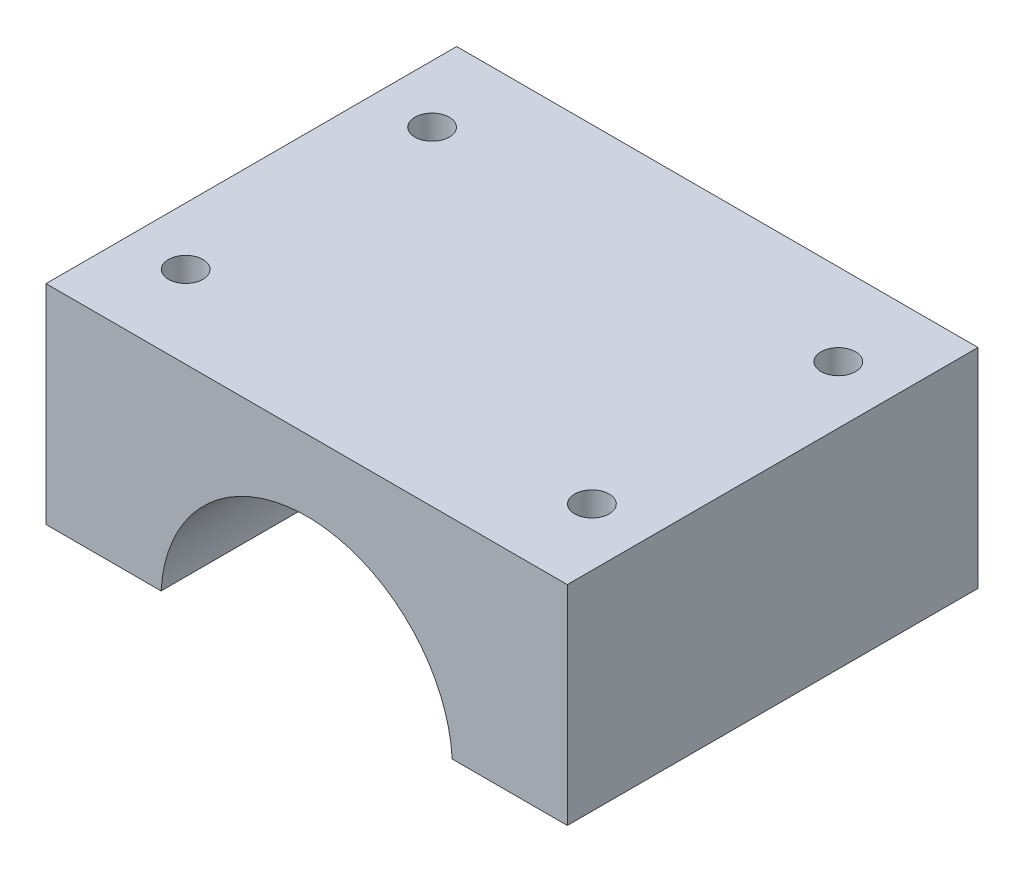
ISO-10303-21;
HEADER;
FILE_DESCRIPTION(('STEP AP214'),'2;1');
FILE_NAME('part.step','',(''),(''),'','','');
FILE_SCHEMA(('AUTOMOTIVE_DESIGN { 1 0 10303 214 1 1 1 1 }'));
ENDSEC;
DATA;
#1=APPLICATION_CONTEXT('core data for automotive mechanical design processes');
#2=APPLICATION_PROTOCOL_DEFINITION('international standard','automotive_design',2000,#1);
#3=PRODUCT_CONTEXT('',#1,'mechanical');
#4=PRODUCT('Part','Part','',(#3));
#5=PRODUCT_RELATED_PRODUCT_CATEGORY('part','',(#4));
#6=PRODUCT_DEFINITION_FORMATION('','',#4);
#7=PRODUCT_DEFINITION_CONTEXT('part definition',#1,'design');
#8=PRODUCT_DEFINITION('design','',#6,#7);
#9=PRODUCT_DEFINITION_SHAPE('','',#8);
#10=(LENGTH_UNIT() NAMED_UNIT(*) SI_UNIT(.MILLI.,.METRE.));
#11=(NAMED_UNIT(*) PLANE_ANGLE_UNIT() SI_UNIT($,.RADIAN.));
#12=(NAMED_UNIT(*) SI_UNIT($,.STERADIAN.) SOLID_ANGLE_UNIT());
#13=UNCERTAINTY_MEASURE_WITH_UNIT(LENGTH_MEASURE(1.E-05),#10,'distance_accuracy_value','');
#14=(GEOMETRIC_REPRESENTATION_CONTEXT(3) GLOBAL_UNCERTAINTY_ASSIGNED_CONTEXT((#13)) GLOBAL_UNIT_ASSIGNED_CONTEXT((#10,
#11,#12)) REPRESENTATION_CONTEXT('',''));
#15=CARTESIAN_POINT('',(0.,0.,0.));
#16=DIRECTION('',(0.,0.,1.));
#17=DIRECTION('',(1.,0.,0.));
#18=AXIS2_PLACEMENT_3D('',#15,#16,#17);
#19=CARTESIAN_POINT('',(17.7218085984473,1.,50.));
#20=DIRECTION('',(0.,1.,0.));
#21=DIRECTION('',(0.,0.,1.));
#22=AXIS2_PLACEMENT_3D('',#19,#20,#21);
#23=PLANE('',#22);
#24=DIRECTION('',(1.,0.,0.));
#25=VECTOR('',#24,1.);
#26=CARTESIAN_POINT('',(17.7218085984473,1.,0.));
#27=LINE('',#26,#25);
#28=CARTESIAN_POINT('',(17.7218085984473,1.,0.));
#29=VERTEX_POINT('',#28);
#30=CARTESIAN_POINT('',(31.734248061046,1.,0.));
#31=VERTEX_POINT('',#30);
#32=EDGE_CURVE('E99',#29,#31,#27,.T.);
#33=ORIENTED_EDGE('',*,*,#32,.T.);
#34=DIRECTION('',(0.,0.,-1.));
#35=VECTOR('',#34,1.);
#36=CARTESIAN_POINT('',(31.734248061046,1.,50.));
#37=LINE('',#36,#35);
#38=CARTESIAN_POINT('',(31.734248061046,1.,50.));
#39=VERTEX_POINT('',#38);
#40=EDGE_CURVE('E151',#39,#31,#37,.T.);
#41=ORIENTED_EDGE('',*,*,#40,.F.);
#42=DIRECTION('',(1.,0.,0.));
#43=VECTOR('',#42,1.);
#44=CARTESIAN_POINT('',(17.7218085984473,1.,50.));
#45=LINE('',#44,#43);
#46=CARTESIAN_POINT('',(17.7218085984473,1.,50.));
#47=VERTEX_POINT('',#46);
#48=EDGE_CURVE('E149',#47,#39,#45,.T.);
#49=ORIENTED_EDGE('',*,*,#48,.F.);
#50=DIRECTION('',(0.,0.,-1.));
#51=VECTOR('',#50,1.);
#52=CARTESIAN_POINT('',(17.7218085984473,1.,50.));
#53=LINE('',#52,#51);
#54=EDGE_CURVE('E157',#47,#29,#53,.T.);
#55=ORIENTED_EDGE('',*,*,#54,.T.);
#56=EDGE_LOOP('',(#33,#41,#49,#55));
#57=FACE_BOUND('',#56,.T.);
#58=CARTESIAN_POINT('',(24.7280283297466,1.,10.0000000000001));
#59=DIRECTION('',(0.,-1.,0.));
#60=DIRECTION('',(0.,0.,-1.));
#61=AXIS2_PLACEMENT_3D('',#58,#59,#60);
#62=CIRCLE('',#61,2.1);
#63=CARTESIAN_POINT('',(24.7280283297466,1.,7.90000000000006));
#64=VERTEX_POINT('',#63);
#65=EDGE_CURVE('E134',#64,#64,#62,.T.);
#66=ORIENTED_EDGE('',*,*,#65,.F.);
#67=EDGE_LOOP('',(#66));
#68=FACE_BOUND('',#67,.T.);
#69=CARTESIAN_POINT('',(24.7280283297466,1.,40.));
#70=DIRECTION('',(0.,-1.,0.));
#71=DIRECTION('',(0.,0.,-1.));
#72=AXIS2_PLACEMENT_3D('',#69,#70,#71);
#73=CIRCLE('',#72,2.1);
#74=CARTESIAN_POINT('',(24.7280283297466,1.,37.9));
#75=VERTEX_POINT('',#74);
#76=EDGE_CURVE('E138',#75,#75,#73,.T.);
#77=ORIENTED_EDGE('',*,*,#76,.F.);
#78=EDGE_LOOP('',(#77));
#79=FACE_BOUND('',#78,.T.);
#80=ADVANCED_FACE('F56',(#57,#68,#79),#23,.F.);
#81=CARTESIAN_POINT('',(-31.734248061046,1.,50.));
#82=DIRECTION('',(0.,1.,0.));
#83=DIRECTION('',(0.,0.,1.));
#84=AXIS2_PLACEMENT_3D('',#81,#82,#83);
#85=PLANE('',#84);
#86=CARTESIAN_POINT('',(-24.7280283297466,1.,40.));
#87=DIRECTION('',(0.,-1.,0.));
#88=DIRECTION('',(0.,0.,-1.));
#89=AXIS2_PLACEMENT_3D('',#86,#87,#88);
#90=CIRCLE('',#89,2.1);
#91=CARTESIAN_POINT('',(-24.7280283297466,1.,37.9));
#92=VERTEX_POINT('',#91);
#93=EDGE_CURVE('E181',#92,#92,#90,.T.);
#94=ORIENTED_EDGE('',*,*,#93,.F.);
#95=EDGE_LOOP('',(#94));
#96=FACE_BOUND('',#95,.T.);
#97=CARTESIAN_POINT('',(-24.7280283297466,1.,10.));
#98=DIRECTION('',(0.,-1.,0.));
#99=DIRECTION('',(0.,0.,-1.));
#100=AXIS2_PLACEMENT_3D('',#97,#98,#99);
#101=CIRCLE('',#100,2.1);
#102=CARTESIAN_POINT('',(-24.7280283297466,1.,7.9));
#103=VERTEX_POINT('',#102);
#104=EDGE_CURVE('E178',#103,#103,#101,.T.);
#105=ORIENTED_EDGE('',*,*,#104,.F.);
#106=EDGE_LOOP('',(#105));
#107=FACE_BOUND('',#106,.T.);
#108=DIRECTION('',(1.,0.,0.));
#109=VECTOR('',#108,1.);
#110=CARTESIAN_POINT('',(-31.734248061046,1.,0.));
#111=LINE('',#110,#109);
#112=CARTESIAN_POINT('',(-31.734248061046,1.,0.));
#113=VERTEX_POINT('',#112);
#114=CARTESIAN_POINT('',(-17.7218085984473,0.999999999999997,0.));
#115=VERTEX_POINT('',#114);
#116=EDGE_CURVE('E144',#113,#115,#111,.T.);
#117=ORIENTED_EDGE('',*,*,#116,.T.);
#118=DIRECTION('',(0.,0.,-1.));
#119=VECTOR('',#118,1.);
#120=CARTESIAN_POINT('',(-17.7218085984473,0.999999999999997,50.));
#121=LINE('',#120,#119);
#122=CARTESIAN_POINT('',(-17.7218085984473,0.999999999999997,50.));
#123=VERTEX_POINT('',#122);
#124=EDGE_CURVE('E64',#123,#115,#121,.T.);
#125=ORIENTED_EDGE('',*,*,#124,.F.);
#126=DIRECTION('',(1.,0.,0.));
#127=VECTOR('',#126,1.);
#128=CARTESIAN_POINT('',(-31.734248061046,1.,50.));
#129=LINE('',#128,#127);
#130=CARTESIAN_POINT('',(-31.734248061046,1.,50.));
#131=VERTEX_POINT('',#130);
#132=EDGE_CURVE('E105',#131,#123,#129,.T.);
#133=ORIENTED_EDGE('',*,*,#132,.F.);
#134=DIRECTION('',(0.,0.,-1.));
#135=VECTOR('',#134,1.);
#136=CARTESIAN_POINT('',(-31.734248061046,1.,50.));
#137=LINE('',#136,#135);
#138=EDGE_CURVE('E12',#131,#113,#137,.T.);
#139=ORIENTED_EDGE('',*,*,#138,.T.);
#140=EDGE_LOOP('',(#117,#125,#133,#139));
#141=FACE_BOUND('',#140,.T.);
#142=ADVANCED_FACE('F58',(#96,#107,#141),#85,.F.);
#143=CARTESIAN_POINT('',(0.,0.,50.));
#144=DIRECTION('',(0.,0.,-1.));
#145=DIRECTION('',(-1.,0.,0.));
#146=AXIS2_PLACEMENT_3D('',#143,#144,#145);
#147=CYLINDRICAL_SURFACE('',#146,17.75);
#148=CARTESIAN_POINT('',(0.,0.,0.));
#149=DIRECTION('',(0.,0.,-1.));
#150=DIRECTION('',(1.,0.,0.));
#151=AXIS2_PLACEMENT_3D('',#148,#149,#150);
#152=CIRCLE('',#151,17.75);
#153=EDGE_CURVE('E153',#115,#29,#152,.T.);
#154=ORIENTED_EDGE('',*,*,#153,.T.);
#155=ORIENTED_EDGE('',*,*,#54,.F.);
#156=CARTESIAN_POINT('',(0.,0.,50.));
#157=DIRECTION('',(0.,0.,-1.));
#158=DIRECTION('',(1.,0.,0.));
#159=AXIS2_PLACEMENT_3D('',#156,#157,#158);
#160=CIRCLE('',#159,17.75);
#161=EDGE_CURVE('E147',#123,#47,#160,.T.);
#162=ORIENTED_EDGE('',*,*,#161,.F.);
#163=ORIENTED_EDGE('',*,*,#124,.T.);
#164=EDGE_LOOP('',(#154,#155,#162,#163));
#165=FACE_BOUND('',#164,.T.);
#166=ADVANCED_FACE('F162',(#165),#147,.F.);
#167=CARTESIAN_POINT('',(0.,0.,50.));
#168=DIRECTION('',(0.,0.,1.));
#169=DIRECTION('',(1.,0.,0.));
#170=AXIS2_PLACEMENT_3D('',#167,#168,#169);
#171=PLANE('',#170);
#172=DIRECTION('',(1.,0.,0.));
#173=VECTOR('',#172,1.);
#174=CARTESIAN_POINT('',(-31.734248061046,26.4,50.));
#175=LINE('',#174,#173);
#176=CARTESIAN_POINT('',(-31.734248061046,26.4,50.));
#177=VERTEX_POINT('',#176);
#178=CARTESIAN_POINT('',(31.734248061046,26.4,50.));
#179=VERTEX_POINT('',#178);
#180=EDGE_CURVE('E122',#177,#179,#175,.T.);
#181=ORIENTED_EDGE('',*,*,#180,.F.);
#182=DIRECTION('',(0.,-1.,0.));
#183=VECTOR('',#182,1.);
#184=CARTESIAN_POINT('',(-31.734248061046,0.,50.));
#185=LINE('',#184,#183);
#186=EDGE_CURVE('E129',#177,#131,#185,.T.);
#187=ORIENTED_EDGE('',*,*,#186,.T.);
#188=ORIENTED_EDGE('',*,*,#132,.T.);
#189=ORIENTED_EDGE('',*,*,#161,.T.);
#190=ORIENTED_EDGE('',*,*,#48,.T.);
#191=DIRECTION('',(0.,-1.,0.));
#192=VECTOR('',#191,1.);
#193=CARTESIAN_POINT('',(31.734248061046,0.,50.));
#194=LINE('',#193,#192);
#195=EDGE_CURVE('E80',#179,#39,#194,.T.);
#196=ORIENTED_EDGE('',*,*,#195,.F.);
#197=EDGE_LOOP('',(#181,#187,#188,#189,#190,#196));
#198=FACE_BOUND('',#197,.T.);
#199=ADVANCED_FACE('F128',(#198),#171,.T.);
#200=CARTESIAN_POINT('',(0.,0.,0.));
#201=DIRECTION('',(0.,0.,1.));
#202=DIRECTION('',(1.,0.,0.));
#203=AXIS2_PLACEMENT_3D('',#200,#201,#202);
#204=PLANE('',#203);
#205=DIRECTION('',(0.,1.,0.));
#206=VECTOR('',#205,1.);
#207=CARTESIAN_POINT('',(-31.734248061046,0.,0.));
#208=LINE('',#207,#206);
#209=CARTESIAN_POINT('',(-31.734248061046,26.4,0.));
#210=VERTEX_POINT('',#209);
#211=EDGE_CURVE('E133',#113,#210,#208,.T.);
#212=ORIENTED_EDGE('',*,*,#211,.T.);
#213=DIRECTION('',(-1.,0.,0.));
#214=VECTOR('',#213,1.);
#215=CARTESIAN_POINT('',(-31.734248061046,26.4,0.));
#216=LINE('',#215,#214);
#217=CARTESIAN_POINT('',(31.734248061046,26.4,0.));
#218=VERTEX_POINT('',#217);
#219=EDGE_CURVE('E71',#218,#210,#216,.T.);
#220=ORIENTED_EDGE('',*,*,#219,.F.);
#221=DIRECTION('',(0.,1.,0.));
#222=VECTOR('',#221,1.);
#223=CARTESIAN_POINT('',(31.734248061046,0.,0.));
#224=LINE('',#223,#222);
#225=EDGE_CURVE('E141',#31,#218,#224,.T.);
#226=ORIENTED_EDGE('',*,*,#225,.F.);
#227=ORIENTED_EDGE('',*,*,#32,.F.);
#228=ORIENTED_EDGE('',*,*,#153,.F.);
#229=ORIENTED_EDGE('',*,*,#116,.F.);
#230=EDGE_LOOP('',(#212,#220,#226,#227,#228,#229));
#231=FACE_BOUND('',#230,.T.);
#232=ADVANCED_FACE('F167',(#231),#204,.F.);
#233=CARTESIAN_POINT('',(31.734248061046,0.,-44.1885166078247));
#234=DIRECTION('',(-1.,0.,0.));
#235=DIRECTION('',(0.,0.,1.));
#236=AXIS2_PLACEMENT_3D('',#233,#234,#235);
#237=PLANE('',#236);
#238=ORIENTED_EDGE('',*,*,#225,.T.);
#239=DIRECTION('',(0.,0.,1.));
#240=VECTOR('',#239,1.);
#241=CARTESIAN_POINT('',(31.734248061046,26.4,-0.001000000000001));
#242=LINE('',#241,#240);
#243=EDGE_CURVE('E126',#218,#179,#242,.T.);
#244=ORIENTED_EDGE('',*,*,#243,.T.);
#245=ORIENTED_EDGE('',*,*,#195,.T.);
#246=ORIENTED_EDGE('',*,*,#40,.T.);
#247=EDGE_LOOP('',(#238,#244,#245,#246));
#248=FACE_BOUND('',#247,.T.);
#249=ADVANCED_FACE('F168',(#248),#237,.F.);
#250=CARTESIAN_POINT('',(-31.734248061046,0.,-44.1885166078247));
#251=DIRECTION('',(-1.,0.,0.));
#252=DIRECTION('',(0.,0.,1.));
#253=AXIS2_PLACEMENT_3D('',#250,#251,#252);
#254=PLANE('',#253);
#255=DIRECTION('',(0.,0.,1.));
#256=VECTOR('',#255,1.);
#257=CARTESIAN_POINT('',(-31.734248061046,26.4,-0.001000000000001));
#258=LINE('',#257,#256);
#259=EDGE_CURVE('E118',#210,#177,#258,.T.);
#260=ORIENTED_EDGE('',*,*,#259,.F.);
#261=ORIENTED_EDGE('',*,*,#211,.F.);
#262=ORIENTED_EDGE('',*,*,#138,.F.);
#263=ORIENTED_EDGE('',*,*,#186,.F.);
#264=EDGE_LOOP('',(#260,#261,#262,#263));
#265=FACE_BOUND('',#264,.T.);
#266=ADVANCED_FACE('F132',(#265),#254,.T.);
#267=CARTESIAN_POINT('',(24.7280283297466,1.,10.0000000000001));
#268=DIRECTION('',(0.,-1.,0.));
#269=DIRECTION('',(0.,0.,-1.));
#270=AXIS2_PLACEMENT_3D('',#267,#268,#269);
#271=CYLINDRICAL_SURFACE('',#270,2.1);
#272=CARTESIAN_POINT('',(24.7280283297466,26.4,10.0000000000001));
#273=DIRECTION('',(0.,-1.,0.));
#274=DIRECTION('',(0.,0.,-1.));
#275=AXIS2_PLACEMENT_3D('',#272,#273,#274);
#276=CIRCLE('',#275,2.1);
#277=CARTESIAN_POINT('',(24.7280283297466,26.4,7.90000000000006));
#278=VERTEX_POINT('',#277);
#279=EDGE_CURVE('E187',#278,#278,#276,.T.);
#280=ORIENTED_EDGE('',*,*,#279,.F.);
#281=EDGE_LOOP('',(#280));
#282=FACE_BOUND('',#281,.T.);
#283=ORIENTED_EDGE('',*,*,#65,.T.);
#284=EDGE_LOOP('',(#283));
#285=FACE_BOUND('',#284,.T.);
#286=ADVANCED_FACE('F220',(#282,#285),#271,.F.);
#287=CARTESIAN_POINT('',(24.7280283297466,1.,40.));
#288=DIRECTION('',(0.,-1.,0.));
#289=DIRECTION('',(0.,0.,-1.));
#290=AXIS2_PLACEMENT_3D('',#287,#288,#289);
#291=CYLINDRICAL_SURFACE('',#290,2.1);
#292=CARTESIAN_POINT('',(24.7280283297466,26.4,40.));
#293=DIRECTION('',(0.,-1.,0.));
#294=DIRECTION('',(0.,0.,-1.));
#295=AXIS2_PLACEMENT_3D('',#292,#293,#294);
#296=CIRCLE('',#295,2.1);
#297=CARTESIAN_POINT('',(24.7280283297466,26.4,37.9));
#298=VERTEX_POINT('',#297);
#299=EDGE_CURVE('E190',#298,#298,#296,.T.);
#300=ORIENTED_EDGE('',*,*,#299,.F.);
#301=EDGE_LOOP('',(#300));
#302=FACE_BOUND('',#301,.T.);
#303=ORIENTED_EDGE('',*,*,#76,.T.);
#304=EDGE_LOOP('',(#303));
#305=FACE_BOUND('',#304,.T.);
#306=ADVANCED_FACE('F214',(#302,#305),#291,.F.);
#307=CARTESIAN_POINT('',(-24.7280283297466,1.,10.));
#308=DIRECTION('',(0.,-1.,0.));
#309=DIRECTION('',(0.,0.,-1.));
#310=AXIS2_PLACEMENT_3D('',#307,#308,#309);
#311=CYLINDRICAL_SURFACE('',#310,2.1);
#312=CARTESIAN_POINT('',(-24.7280283297466,26.4,10.));
#313=DIRECTION('',(0.,-1.,0.));
#314=DIRECTION('',(0.,0.,-1.));
#315=AXIS2_PLACEMENT_3D('',#312,#313,#314);
#316=CIRCLE('',#315,2.1);
#317=CARTESIAN_POINT('',(-24.7280283297466,26.4,7.90000000000001));
#318=VERTEX_POINT('',#317);
#319=EDGE_CURVE('E193',#318,#318,#316,.T.);
#320=ORIENTED_EDGE('',*,*,#319,.F.);
#321=EDGE_LOOP('',(#320));
#322=FACE_BOUND('',#321,.T.);
#323=ORIENTED_EDGE('',*,*,#104,.T.);
#324=EDGE_LOOP('',(#323));
#325=FACE_BOUND('',#324,.T.);
#326=ADVANCED_FACE('F205',(#322,#325),#311,.F.);
#327=CARTESIAN_POINT('',(-24.7280283297466,1.,40.));
#328=DIRECTION('',(0.,-1.,0.));
#329=DIRECTION('',(0.,0.,-1.));
#330=AXIS2_PLACEMENT_3D('',#327,#328,#329);
#331=CYLINDRICAL_SURFACE('',#330,2.1);
#332=CARTESIAN_POINT('',(-24.7280283297466,26.4,40.));
#333=DIRECTION('',(0.,-1.,0.));
#334=DIRECTION('',(0.,0.,-1.));
#335=AXIS2_PLACEMENT_3D('',#332,#333,#334);
#336=CIRCLE('',#335,2.1);
#337=CARTESIAN_POINT('',(-24.7280283297466,26.4,37.9));
#338=VERTEX_POINT('',#337);
#339=EDGE_CURVE('E196',#338,#338,#336,.T.);
#340=ORIENTED_EDGE('',*,*,#339,.F.);
#341=EDGE_LOOP('',(#340));
#342=FACE_BOUND('',#341,.T.);
#343=ORIENTED_EDGE('',*,*,#93,.T.);
#344=EDGE_LOOP('',(#343));
#345=FACE_BOUND('',#344,.T.);
#346=ADVANCED_FACE('F202',(#342,#345),#331,.F.);
#347=CARTESIAN_POINT('',(-31.734248061046,26.4,-0.001000000000001));
#348=DIRECTION('',(0.,-1.,0.));
#349=DIRECTION('',(0.,0.,-1.));
#350=AXIS2_PLACEMENT_3D('',#347,#348,#349);
#351=PLANE('',#350);
#352=ORIENTED_EDGE('',*,*,#219,.T.);
#353=ORIENTED_EDGE('',*,*,#259,.T.);
#354=ORIENTED_EDGE('',*,*,#180,.T.);
#355=ORIENTED_EDGE('',*,*,#243,.F.);
#356=EDGE_LOOP('',(#352,#353,#354,#355));
#357=FACE_BOUND('',#356,.T.);
#358=ORIENTED_EDGE('',*,*,#279,.T.);
#359=EDGE_LOOP('',(#358));
#360=FACE_BOUND('',#359,.T.);
#361=ORIENTED_EDGE('',*,*,#299,.T.);
#362=EDGE_LOOP('',(#361));
#363=FACE_BOUND('',#362,.T.);
#364=ORIENTED_EDGE('',*,*,#319,.T.);
#365=EDGE_LOOP('',(#364));
#366=FACE_BOUND('',#365,.T.);
#367=ORIENTED_EDGE('',*,*,#339,.T.);
#368=EDGE_LOOP('',(#367));
#369=FACE_BOUND('',#368,.T.);
#370=ADVANCED_FACE('F120',(#357,#360,#363,#366,#369),#351,.F.);
#371=CLOSED_SHELL('',(#80,#142,#166,#199,#232,#249,#266,#286,#306,#326,#346,#370));
#372=MANIFOLD_SOLID_BREP('B2',#371);
#373=ADVANCED_BREP_SHAPE_REPRESENTATION('',(#18,#372),#14);
#374=SHAPE_DEFINITION_REPRESENTATION(#9,#373);
ENDSEC;
END-ISO-10303-21;
